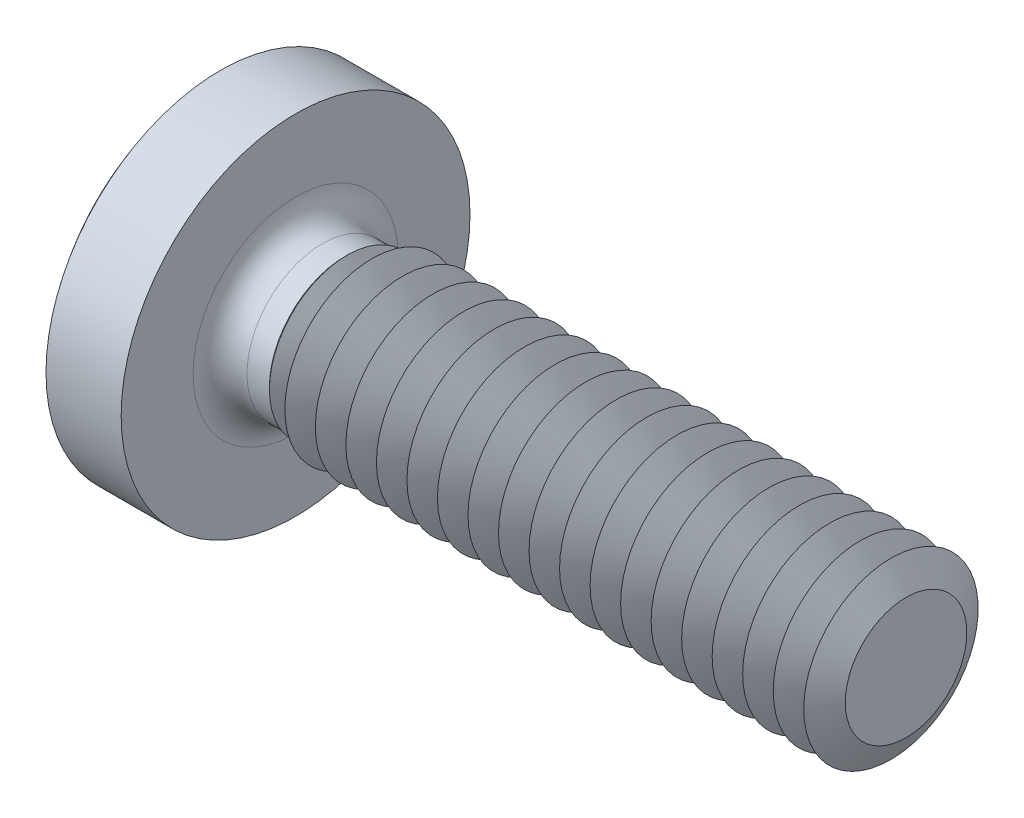
ISO-10303-21;
HEADER;
FILE_DESCRIPTION(('STEP AP214'),'2;1');
FILE_NAME('part.step','',(''),(''),'','','');
FILE_SCHEMA(('AUTOMOTIVE_DESIGN { 1 0 10303 214 1 1 1 1 }'));
ENDSEC;
DATA;
#1=APPLICATION_CONTEXT('core data for automotive mechanical design processes');
#2=APPLICATION_PROTOCOL_DEFINITION('international standard','automotive_design',2000,#1);
#3=PRODUCT_CONTEXT('',#1,'mechanical');
#4=PRODUCT('Part','Part','',(#3));
#5=PRODUCT_RELATED_PRODUCT_CATEGORY('part','',(#4));
#6=PRODUCT_DEFINITION_FORMATION('','',#4);
#7=PRODUCT_DEFINITION_CONTEXT('part definition',#1,'design');
#8=PRODUCT_DEFINITION('design','',#6,#7);
#9=PRODUCT_DEFINITION_SHAPE('','',#8);
#10=(LENGTH_UNIT() NAMED_UNIT(*) SI_UNIT(.MILLI.,.METRE.));
#11=(NAMED_UNIT(*) PLANE_ANGLE_UNIT() SI_UNIT($,.RADIAN.));
#12=(NAMED_UNIT(*) SI_UNIT($,.STERADIAN.) SOLID_ANGLE_UNIT());
#13=UNCERTAINTY_MEASURE_WITH_UNIT(LENGTH_MEASURE(1.E-05),#10,'distance_accuracy_value','');
#14=(GEOMETRIC_REPRESENTATION_CONTEXT(3) GLOBAL_UNCERTAINTY_ASSIGNED_CONTEXT((#13)) GLOBAL_UNIT_ASSIGNED_CONTEXT((#10,
#11,#12)) REPRESENTATION_CONTEXT('',''));
#15=CARTESIAN_POINT('',(0.,0.,0.));
#16=DIRECTION('',(0.,0.,1.));
#17=DIRECTION('',(1.,0.,0.));
#18=AXIS2_PLACEMENT_3D('',#15,#16,#17);
#19=CARTESIAN_POINT('',(2.4,0.,0.));
#20=DIRECTION('',(0.144306893071729,0.,-0.989532981063282));
#21=DIRECTION('',(-0.989532981063282,0.,-0.144306893071729));
#22=AXIS2_PLACEMENT_3D('',#19,#20,#21);
#23=PLANE('',#22);
#24=DIRECTION('',(-0.732931208059297,-0.671853607387689,-0.106885801175314));
#25=VECTOR('',#24,1.);
#26=CARTESIAN_POINT('',(2.4,0.,0.));
#27=LINE('',#26,#25);
#28=CARTESIAN_POINT('',(2.4,0.,0.));
#29=VERTEX_POINT('',#28);
#30=CARTESIAN_POINT('',(0.299339193338267,-1.92560573943992,-0.30634636763817));
#31=VERTEX_POINT('',#30);
#32=EDGE_CURVE('E156',#29,#31,#27,.T.);
#33=ORIENTED_EDGE('',*,*,#32,.F.);
#34=DIRECTION('',(-0.979387903800927,-0.142827402637635,-0.142827402637635));
#35=VECTOR('',#34,1.);
#36=CARTESIAN_POINT('',(2.4,0.,0.));
#37=LINE('',#36,#35);
#38=CARTESIAN_POINT('',(0.0185820115886168,-0.347290123309992,-0.347290123309993));
#39=VERTEX_POINT('',#38);
#40=EDGE_CURVE('E117',#29,#39,#37,.T.);
#41=ORIENTED_EDGE('',*,*,#40,.T.);
#42=CARTESIAN_POINT('',(6.41461963450914,0.,0.585465363365916));
#43=DIRECTION('',(0.144306893071729,0.,-0.989532981063282));
#44=DIRECTION('',(-0.989532981063282,0.,-0.144306893071729));
#45=AXIS2_PLACEMENT_3D('',#42,#43,#44);
#46=CIRCLE('',#45,6.47301633718682);
#47=EDGE_CURVE('E130',#31,#39,#46,.T.);
#48=ORIENTED_EDGE('',*,*,#47,.F.);
#49=EDGE_LOOP('',(#33,#41,#48));
#50=FACE_BOUND('',#49,.T.);
#51=ADVANCED_FACE('F37',(#50),#23,.F.);
#52=CARTESIAN_POINT('',(2.4,0.,0.));
#53=DIRECTION('',(0.144306893071729,0.,0.989532981063282));
#54=DIRECTION('',(0.989532981063282,0.,-0.144306893071729));
#55=AXIS2_PLACEMENT_3D('',#52,#53,#54);
#56=PLANE('',#55);
#57=CARTESIAN_POINT('',(6.41461963450914,0.,-0.585465363365916));
#58=DIRECTION('',(0.144306893071729,0.,0.989532981063282));
#59=DIRECTION('',(0.989532981063282,0.,-0.144306893071729));
#60=AXIS2_PLACEMENT_3D('',#57,#58,#59);
#61=CIRCLE('',#60,6.47301633718682);
#62=CARTESIAN_POINT('',(0.0185820115886177,-0.347290123309995,0.347290123309993));
#63=VERTEX_POINT('',#62);
#64=CARTESIAN_POINT('',(0.299339193338266,-1.92560573943992,0.30634636763817));
#65=VERTEX_POINT('',#64);
#66=EDGE_CURVE('E60',#63,#65,#61,.T.);
#67=ORIENTED_EDGE('',*,*,#66,.F.);
#68=DIRECTION('',(0.979387903800927,0.142827402637636,-0.142827402637635));
#69=VECTOR('',#68,1.);
#70=CARTESIAN_POINT('',(2.4,0.,0.));
#71=LINE('',#70,#69);
#72=EDGE_CURVE('E11',#63,#29,#71,.T.);
#73=ORIENTED_EDGE('',*,*,#72,.T.);
#74=DIRECTION('',(-0.732931208059297,-0.671853607387689,0.106885801175314));
#75=VECTOR('',#74,1.);
#76=CARTESIAN_POINT('',(2.4,0.,0.));
#77=LINE('',#76,#75);
#78=EDGE_CURVE('E157',#29,#65,#77,.T.);
#79=ORIENTED_EDGE('',*,*,#78,.T.);
#80=EDGE_LOOP('',(#67,#73,#79));
#81=FACE_BOUND('',#80,.T.);
#82=ADVANCED_FACE('F172',(#81),#56,.F.);
#83=CARTESIAN_POINT('',(14.653791204021,0.,0.));
#84=DIRECTION('',(-1.,0.,0.));
#85=DIRECTION('',(0.,0.,1.));
#86=AXIS2_PLACEMENT_3D('',#83,#84,#85);
#87=CONICAL_SURFACE('',#86,2.,1.05188801855299);
#88=CARTESIAN_POINT('',(15.,0.,0.));
#89=DIRECTION('',(-1.,0.,0.));
#90=DIRECTION('',(0.,0.,1.));
#91=AXIS2_PLACEMENT_3D('',#88,#89,#90);
#92=CIRCLE('',#91,1.3938);
#93=CARTESIAN_POINT('',(15.,0.,1.3938));
#94=VERTEX_POINT('',#93);
#95=EDGE_CURVE('E278',#94,#94,#92,.T.);
#96=ORIENTED_EDGE('',*,*,#95,.T.);
#97=EDGE_LOOP('',(#96));
#98=FACE_BOUND('',#97,.T.);
#99=CARTESIAN_POINT('',(14.653791204021,0.,0.));
#100=DIRECTION('',(-1.,0.,0.));
#101=DIRECTION('',(0.,0.,1.));
#102=AXIS2_PLACEMENT_3D('',#99,#100,#101);
#103=CIRCLE('',#102,2.);
#104=CARTESIAN_POINT('',(14.653791204021,0.,2.));
#105=VERTEX_POINT('',#104);
#106=EDGE_CURVE('E275',#105,#105,#103,.T.);
#107=ORIENTED_EDGE('',*,*,#106,.F.);
#108=EDGE_LOOP('',(#107));
#109=FACE_BOUND('',#108,.T.);
#110=ADVANCED_FACE('F361',(#98,#109),#87,.T.);
#111=CARTESIAN_POINT('',(15.,0.,0.));
#112=DIRECTION('',(1.,0.,0.));
#113=DIRECTION('',(0.,0.,-1.));
#114=AXIS2_PLACEMENT_3D('',#111,#112,#113);
#115=CONICAL_SURFACE('',#114,1.3938,1.04250708384022);
#116=CARTESIAN_POINT('',(15.353791204021,0.,0.));
#117=DIRECTION('',(-1.,0.,0.));
#118=DIRECTION('',(0.,0.,1.));
#119=AXIS2_PLACEMENT_3D('',#116,#117,#118);
#120=CIRCLE('',#119,2.);
#121=CARTESIAN_POINT('',(15.353791204021,0.,2.));
#122=VERTEX_POINT('',#121);
#123=EDGE_CURVE('E281',#122,#122,#120,.T.);
#124=ORIENTED_EDGE('',*,*,#123,.T.);
#125=EDGE_LOOP('',(#124));
#126=FACE_BOUND('',#125,.T.);
#127=ORIENTED_EDGE('',*,*,#95,.F.);
#128=EDGE_LOOP('',(#127));
#129=FACE_BOUND('',#128,.T.);
#130=ADVANCED_FACE('F777',(#126,#129),#115,.T.);
#131=CARTESIAN_POINT('',(17.1,0.,0.));
#132=DIRECTION('',(-1.,0.,0.));
#133=DIRECTION('',(0.,0.,1.));
#134=AXIS2_PLACEMENT_3D('',#131,#132,#133);
#135=PLANE('',#134);
#136=CARTESIAN_POINT('',(17.1,0.,0.));
#137=DIRECTION('',(-1.,0.,0.));
#138=DIRECTION('',(0.,0.,1.));
#139=AXIS2_PLACEMENT_3D('',#136,#137,#138);
#140=CIRCLE('',#139,1.3938);
#141=CARTESIAN_POINT('',(17.1,0.,1.3938));
#142=VERTEX_POINT('',#141);
#143=EDGE_CURVE('E296',#142,#142,#140,.T.);
#144=ORIENTED_EDGE('',*,*,#143,.F.);
#145=EDGE_LOOP('',(#144));
#146=FACE_BOUND('',#145,.T.);
#147=ADVANCED_FACE('F781',(#146),#135,.F.);
#148=CARTESIAN_POINT('',(16.753791204021,0.,0.));
#149=DIRECTION('',(-1.,0.,0.));
#150=DIRECTION('',(0.,0.,1.));
#151=AXIS2_PLACEMENT_3D('',#148,#149,#150);
#152=CONICAL_SURFACE('',#151,2.,1.05188801855299);
#153=ORIENTED_EDGE('',*,*,#143,.T.);
#154=EDGE_LOOP('',(#153));
#155=FACE_BOUND('',#154,.T.);
#156=CARTESIAN_POINT('',(16.753791204021,0.,0.));
#157=DIRECTION('',(-1.,0.,0.));
#158=DIRECTION('',(0.,0.,1.));
#159=AXIS2_PLACEMENT_3D('',#156,#157,#158);
#160=CIRCLE('',#159,2.);
#161=CARTESIAN_POINT('',(16.753791204021,0.,2.));
#162=VERTEX_POINT('',#161);
#163=EDGE_CURVE('E293',#162,#162,#160,.T.);
#164=ORIENTED_EDGE('',*,*,#163,.F.);
#165=EDGE_LOOP('',(#164));
#166=FACE_BOUND('',#165,.T.);
#167=ADVANCED_FACE('F769',(#155,#166),#152,.T.);
#168=CARTESIAN_POINT('',(16.4,0.,0.));
#169=DIRECTION('',(1.,0.,0.));
#170=DIRECTION('',(0.,0.,-1.));
#171=AXIS2_PLACEMENT_3D('',#168,#169,#170);
#172=CONICAL_SURFACE('',#171,1.3938,1.04250708384022);
#173=ORIENTED_EDGE('',*,*,#163,.T.);
#174=EDGE_LOOP('',(#173));
#175=FACE_BOUND('',#174,.T.);
#176=CARTESIAN_POINT('',(16.4,0.,0.));
#177=DIRECTION('',(-1.,0.,0.));
#178=DIRECTION('',(0.,0.,1.));
#179=AXIS2_PLACEMENT_3D('',#176,#177,#178);
#180=CIRCLE('',#179,1.3938);
#181=CARTESIAN_POINT('',(16.4,0.,1.3938));
#182=VERTEX_POINT('',#181);
#183=EDGE_CURVE('E290',#182,#182,#180,.T.);
#184=ORIENTED_EDGE('',*,*,#183,.F.);
#185=EDGE_LOOP('',(#184));
#186=FACE_BOUND('',#185,.T.);
#187=ADVANCED_FACE('F759',(#175,#186),#172,.T.);
#188=CARTESIAN_POINT('',(16.053791204021,0.,0.));
#189=DIRECTION('',(-1.,0.,0.));
#190=DIRECTION('',(0.,0.,1.));
#191=AXIS2_PLACEMENT_3D('',#188,#189,#190);
#192=CONICAL_SURFACE('',#191,2.,1.05188801855299);
#193=ORIENTED_EDGE('',*,*,#183,.T.);
#194=EDGE_LOOP('',(#193));
#195=FACE_BOUND('',#194,.T.);
#196=CARTESIAN_POINT('',(16.053791204021,0.,0.));
#197=DIRECTION('',(-1.,0.,0.));
#198=DIRECTION('',(0.,0.,1.));
#199=AXIS2_PLACEMENT_3D('',#196,#197,#198);
#200=CIRCLE('',#199,2.);
#201=CARTESIAN_POINT('',(16.053791204021,0.,2.));
#202=VERTEX_POINT('',#201);
#203=EDGE_CURVE('E287',#202,#202,#200,.T.);
#204=ORIENTED_EDGE('',*,*,#203,.F.);
#205=EDGE_LOOP('',(#204));
#206=FACE_BOUND('',#205,.T.);
#207=ADVANCED_FACE('F749',(#195,#206),#192,.T.);
#208=CARTESIAN_POINT('',(15.7,0.,0.));
#209=DIRECTION('',(1.,0.,0.));
#210=DIRECTION('',(0.,0.,-1.));
#211=AXIS2_PLACEMENT_3D('',#208,#209,#210);
#212=CONICAL_SURFACE('',#211,1.3938,1.04250708384022);
#213=ORIENTED_EDGE('',*,*,#203,.T.);
#214=EDGE_LOOP('',(#213));
#215=FACE_BOUND('',#214,.T.);
#216=CARTESIAN_POINT('',(15.7,0.,0.));
#217=DIRECTION('',(-1.,0.,0.));
#218=DIRECTION('',(0.,0.,1.));
#219=AXIS2_PLACEMENT_3D('',#216,#217,#218);
#220=CIRCLE('',#219,1.3938);
#221=CARTESIAN_POINT('',(15.7,0.,1.3938));
#222=VERTEX_POINT('',#221);
#223=EDGE_CURVE('E284',#222,#222,#220,.T.);
#224=ORIENTED_EDGE('',*,*,#223,.F.);
#225=EDGE_LOOP('',(#224));
#226=FACE_BOUND('',#225,.T.);
#227=ADVANCED_FACE('F739',(#215,#226),#212,.T.);
#228=CARTESIAN_POINT('',(15.353791204021,0.,0.));
#229=DIRECTION('',(-1.,0.,0.));
#230=DIRECTION('',(0.,0.,1.));
#231=AXIS2_PLACEMENT_3D('',#228,#229,#230);
#232=CONICAL_SURFACE('',#231,2.,1.05188801855299);
#233=ORIENTED_EDGE('',*,*,#223,.T.);
#234=EDGE_LOOP('',(#233));
#235=FACE_BOUND('',#234,.T.);
#236=ORIENTED_EDGE('',*,*,#123,.F.);
#237=EDGE_LOOP('',(#236));
#238=FACE_BOUND('',#237,.T.);
#239=ADVANCED_FACE('F729',(#235,#238),#232,.T.);
#240=CARTESIAN_POINT('',(13.953791204021,0.,0.));
#241=DIRECTION('',(-1.,0.,0.));
#242=DIRECTION('',(0.,0.,1.));
#243=AXIS2_PLACEMENT_3D('',#240,#241,#242);
#244=CONICAL_SURFACE('',#243,2.,1.05188801855299);
#245=CARTESIAN_POINT('',(14.3,0.,0.));
#246=DIRECTION('',(-1.,0.,0.));
#247=DIRECTION('',(0.,0.,1.));
#248=AXIS2_PLACEMENT_3D('',#245,#246,#247);
#249=CIRCLE('',#248,1.3938);
#250=CARTESIAN_POINT('',(14.3,0.,1.3938));
#251=VERTEX_POINT('',#250);
#252=EDGE_CURVE('E272',#251,#251,#249,.T.);
#253=ORIENTED_EDGE('',*,*,#252,.T.);
#254=EDGE_LOOP('',(#253));
#255=FACE_BOUND('',#254,.T.);
#256=CARTESIAN_POINT('',(13.953791204021,0.,0.));
#257=DIRECTION('',(-1.,0.,0.));
#258=DIRECTION('',(0.,0.,1.));
#259=AXIS2_PLACEMENT_3D('',#256,#257,#258);
#260=CIRCLE('',#259,2.);
#261=CARTESIAN_POINT('',(13.953791204021,0.,2.));
#262=VERTEX_POINT('',#261);
#263=EDGE_CURVE('E269',#262,#262,#260,.T.);
#264=ORIENTED_EDGE('',*,*,#263,.F.);
#265=EDGE_LOOP('',(#264));
#266=FACE_BOUND('',#265,.T.);
#267=ADVANCED_FACE('F719',(#255,#266),#244,.T.);
#268=CARTESIAN_POINT('',(14.3,0.,0.));
#269=DIRECTION('',(1.,0.,0.));
#270=DIRECTION('',(0.,0.,-1.));
#271=AXIS2_PLACEMENT_3D('',#268,#269,#270);
#272=CONICAL_SURFACE('',#271,1.3938,1.04250708384022);
#273=ORIENTED_EDGE('',*,*,#106,.T.);
#274=EDGE_LOOP('',(#273));
#275=FACE_BOUND('',#274,.T.);
#276=ORIENTED_EDGE('',*,*,#252,.F.);
#277=EDGE_LOOP('',(#276));
#278=FACE_BOUND('',#277,.T.);
#279=ADVANCED_FACE('F709',(#275,#278),#272,.T.);
#280=CARTESIAN_POINT('',(13.253791204021,0.,0.));
#281=DIRECTION('',(-1.,0.,0.));
#282=DIRECTION('',(0.,0.,1.));
#283=AXIS2_PLACEMENT_3D('',#280,#281,#282);
#284=CONICAL_SURFACE('',#283,2.,1.05188801855299);
#285=CARTESIAN_POINT('',(13.6,0.,0.));
#286=DIRECTION('',(-1.,0.,0.));
#287=DIRECTION('',(0.,0.,1.));
#288=AXIS2_PLACEMENT_3D('',#285,#286,#287);
#289=CIRCLE('',#288,1.3938);
#290=CARTESIAN_POINT('',(13.6,0.,1.3938));
#291=VERTEX_POINT('',#290);
#292=EDGE_CURVE('E266',#291,#291,#289,.T.);
#293=ORIENTED_EDGE('',*,*,#292,.T.);
#294=EDGE_LOOP('',(#293));
#295=FACE_BOUND('',#294,.T.);
#296=CARTESIAN_POINT('',(13.253791204021,0.,0.));
#297=DIRECTION('',(-1.,0.,0.));
#298=DIRECTION('',(0.,0.,1.));
#299=AXIS2_PLACEMENT_3D('',#296,#297,#298);
#300=CIRCLE('',#299,2.);
#301=CARTESIAN_POINT('',(13.253791204021,0.,2.));
#302=VERTEX_POINT('',#301);
#303=EDGE_CURVE('E263',#302,#302,#300,.T.);
#304=ORIENTED_EDGE('',*,*,#303,.F.);
#305=EDGE_LOOP('',(#304));
#306=FACE_BOUND('',#305,.T.);
#307=ADVANCED_FACE('F699',(#295,#306),#284,.T.);
#308=CARTESIAN_POINT('',(13.6,0.,0.));
#309=DIRECTION('',(1.,0.,0.));
#310=DIRECTION('',(0.,0.,-1.));
#311=AXIS2_PLACEMENT_3D('',#308,#309,#310);
#312=CONICAL_SURFACE('',#311,1.3938,1.04250708384022);
#313=ORIENTED_EDGE('',*,*,#263,.T.);
#314=EDGE_LOOP('',(#313));
#315=FACE_BOUND('',#314,.T.);
#316=ORIENTED_EDGE('',*,*,#292,.F.);
#317=EDGE_LOOP('',(#316));
#318=FACE_BOUND('',#317,.T.);
#319=ADVANCED_FACE('F689',(#315,#318),#312,.T.);
#320=CARTESIAN_POINT('',(12.553791204021,0.,0.));
#321=DIRECTION('',(-1.,0.,0.));
#322=DIRECTION('',(0.,0.,1.));
#323=AXIS2_PLACEMENT_3D('',#320,#321,#322);
#324=CONICAL_SURFACE('',#323,2.,1.05188801855299);
#325=CARTESIAN_POINT('',(12.9,0.,0.));
#326=DIRECTION('',(-1.,0.,0.));
#327=DIRECTION('',(0.,0.,1.));
#328=AXIS2_PLACEMENT_3D('',#325,#326,#327);
#329=CIRCLE('',#328,1.3938);
#330=CARTESIAN_POINT('',(12.9,0.,1.3938));
#331=VERTEX_POINT('',#330);
#332=EDGE_CURVE('E260',#331,#331,#329,.T.);
#333=ORIENTED_EDGE('',*,*,#332,.T.);
#334=EDGE_LOOP('',(#333));
#335=FACE_BOUND('',#334,.T.);
#336=CARTESIAN_POINT('',(12.553791204021,0.,0.));
#337=DIRECTION('',(-1.,0.,0.));
#338=DIRECTION('',(0.,0.,1.));
#339=AXIS2_PLACEMENT_3D('',#336,#337,#338);
#340=CIRCLE('',#339,2.);
#341=CARTESIAN_POINT('',(12.553791204021,0.,2.));
#342=VERTEX_POINT('',#341);
#343=EDGE_CURVE('E257',#342,#342,#340,.T.);
#344=ORIENTED_EDGE('',*,*,#343,.F.);
#345=EDGE_LOOP('',(#344));
#346=FACE_BOUND('',#345,.T.);
#347=ADVANCED_FACE('F679',(#335,#346),#324,.T.);
#348=CARTESIAN_POINT('',(12.9,0.,0.));
#349=DIRECTION('',(1.,0.,0.));
#350=DIRECTION('',(0.,0.,-1.));
#351=AXIS2_PLACEMENT_3D('',#348,#349,#350);
#352=CONICAL_SURFACE('',#351,1.3938,1.04250708384022);
#353=ORIENTED_EDGE('',*,*,#303,.T.);
#354=EDGE_LOOP('',(#353));
#355=FACE_BOUND('',#354,.T.);
#356=ORIENTED_EDGE('',*,*,#332,.F.);
#357=EDGE_LOOP('',(#356));
#358=FACE_BOUND('',#357,.T.);
#359=ADVANCED_FACE('F669',(#355,#358),#352,.T.);
#360=CARTESIAN_POINT('',(11.853791204021,0.,0.));
#361=DIRECTION('',(-1.,0.,0.));
#362=DIRECTION('',(0.,0.,1.));
#363=AXIS2_PLACEMENT_3D('',#360,#361,#362);
#364=CONICAL_SURFACE('',#363,2.,1.05188801855299);
#365=CARTESIAN_POINT('',(12.2,0.,0.));
#366=DIRECTION('',(-1.,0.,0.));
#367=DIRECTION('',(0.,0.,1.));
#368=AXIS2_PLACEMENT_3D('',#365,#366,#367);
#369=CIRCLE('',#368,1.3938);
#370=CARTESIAN_POINT('',(12.2,0.,1.3938));
#371=VERTEX_POINT('',#370);
#372=EDGE_CURVE('E254',#371,#371,#369,.T.);
#373=ORIENTED_EDGE('',*,*,#372,.T.);
#374=EDGE_LOOP('',(#373));
#375=FACE_BOUND('',#374,.T.);
#376=CARTESIAN_POINT('',(11.853791204021,0.,0.));
#377=DIRECTION('',(-1.,0.,0.));
#378=DIRECTION('',(0.,0.,1.));
#379=AXIS2_PLACEMENT_3D('',#376,#377,#378);
#380=CIRCLE('',#379,2.);
#381=CARTESIAN_POINT('',(11.853791204021,0.,2.));
#382=VERTEX_POINT('',#381);
#383=EDGE_CURVE('E251',#382,#382,#380,.T.);
#384=ORIENTED_EDGE('',*,*,#383,.F.);
#385=EDGE_LOOP('',(#384));
#386=FACE_BOUND('',#385,.T.);
#387=ADVANCED_FACE('F659',(#375,#386),#364,.T.);
#388=CARTESIAN_POINT('',(12.2,0.,0.));
#389=DIRECTION('',(1.,0.,0.));
#390=DIRECTION('',(0.,0.,-1.));
#391=AXIS2_PLACEMENT_3D('',#388,#389,#390);
#392=CONICAL_SURFACE('',#391,1.3938,1.04250708384022);
#393=ORIENTED_EDGE('',*,*,#343,.T.);
#394=EDGE_LOOP('',(#393));
#395=FACE_BOUND('',#394,.T.);
#396=ORIENTED_EDGE('',*,*,#372,.F.);
#397=EDGE_LOOP('',(#396));
#398=FACE_BOUND('',#397,.T.);
#399=ADVANCED_FACE('F649',(#395,#398),#392,.T.);
#400=CARTESIAN_POINT('',(11.153791204021,0.,0.));
#401=DIRECTION('',(-1.,0.,0.));
#402=DIRECTION('',(0.,0.,1.));
#403=AXIS2_PLACEMENT_3D('',#400,#401,#402);
#404=CONICAL_SURFACE('',#403,2.,1.05188801855299);
#405=CARTESIAN_POINT('',(11.5,0.,0.));
#406=DIRECTION('',(-1.,0.,0.));
#407=DIRECTION('',(0.,0.,1.));
#408=AXIS2_PLACEMENT_3D('',#405,#406,#407);
#409=CIRCLE('',#408,1.3938);
#410=CARTESIAN_POINT('',(11.5,0.,1.3938));
#411=VERTEX_POINT('',#410);
#412=EDGE_CURVE('E248',#411,#411,#409,.T.);
#413=ORIENTED_EDGE('',*,*,#412,.T.);
#414=EDGE_LOOP('',(#413));
#415=FACE_BOUND('',#414,.T.);
#416=CARTESIAN_POINT('',(11.153791204021,0.,0.));
#417=DIRECTION('',(-1.,0.,0.));
#418=DIRECTION('',(0.,0.,1.));
#419=AXIS2_PLACEMENT_3D('',#416,#417,#418);
#420=CIRCLE('',#419,2.);
#421=CARTESIAN_POINT('',(11.153791204021,0.,2.));
#422=VERTEX_POINT('',#421);
#423=EDGE_CURVE('E245',#422,#422,#420,.T.);
#424=ORIENTED_EDGE('',*,*,#423,.F.);
#425=EDGE_LOOP('',(#424));
#426=FACE_BOUND('',#425,.T.);
#427=ADVANCED_FACE('F639',(#415,#426),#404,.T.);
#428=CARTESIAN_POINT('',(11.5,0.,0.));
#429=DIRECTION('',(1.,0.,0.));
#430=DIRECTION('',(0.,0.,-1.));
#431=AXIS2_PLACEMENT_3D('',#428,#429,#430);
#432=CONICAL_SURFACE('',#431,1.3938,1.04250708384022);
#433=ORIENTED_EDGE('',*,*,#383,.T.);
#434=EDGE_LOOP('',(#433));
#435=FACE_BOUND('',#434,.T.);
#436=ORIENTED_EDGE('',*,*,#412,.F.);
#437=EDGE_LOOP('',(#436));
#438=FACE_BOUND('',#437,.T.);
#439=ADVANCED_FACE('F629',(#435,#438),#432,.T.);
#440=CARTESIAN_POINT('',(10.453791204021,0.,0.));
#441=DIRECTION('',(-1.,0.,0.));
#442=DIRECTION('',(0.,0.,1.));
#443=AXIS2_PLACEMENT_3D('',#440,#441,#442);
#444=CONICAL_SURFACE('',#443,2.,1.05188801855299);
#445=CARTESIAN_POINT('',(10.8,0.,0.));
#446=DIRECTION('',(-1.,0.,0.));
#447=DIRECTION('',(0.,0.,1.));
#448=AXIS2_PLACEMENT_3D('',#445,#446,#447);
#449=CIRCLE('',#448,1.3938);
#450=CARTESIAN_POINT('',(10.8,0.,1.3938));
#451=VERTEX_POINT('',#450);
#452=EDGE_CURVE('E242',#451,#451,#449,.T.);
#453=ORIENTED_EDGE('',*,*,#452,.T.);
#454=EDGE_LOOP('',(#453));
#455=FACE_BOUND('',#454,.T.);
#456=CARTESIAN_POINT('',(10.453791204021,0.,0.));
#457=DIRECTION('',(-1.,0.,0.));
#458=DIRECTION('',(0.,0.,1.));
#459=AXIS2_PLACEMENT_3D('',#456,#457,#458);
#460=CIRCLE('',#459,2.);
#461=CARTESIAN_POINT('',(10.453791204021,0.,2.));
#462=VERTEX_POINT('',#461);
#463=EDGE_CURVE('E239',#462,#462,#460,.T.);
#464=ORIENTED_EDGE('',*,*,#463,.F.);
#465=EDGE_LOOP('',(#464));
#466=FACE_BOUND('',#465,.T.);
#467=ADVANCED_FACE('F619',(#455,#466),#444,.T.);
#468=CARTESIAN_POINT('',(10.8,0.,0.));
#469=DIRECTION('',(1.,0.,0.));
#470=DIRECTION('',(0.,0.,-1.));
#471=AXIS2_PLACEMENT_3D('',#468,#469,#470);
#472=CONICAL_SURFACE('',#471,1.3938,1.04250708384022);
#473=ORIENTED_EDGE('',*,*,#423,.T.);
#474=EDGE_LOOP('',(#473));
#475=FACE_BOUND('',#474,.T.);
#476=ORIENTED_EDGE('',*,*,#452,.F.);
#477=EDGE_LOOP('',(#476));
#478=FACE_BOUND('',#477,.T.);
#479=ADVANCED_FACE('F609',(#475,#478),#472,.T.);
#480=CARTESIAN_POINT('',(9.75379120402105,0.,0.));
#481=DIRECTION('',(-1.,0.,0.));
#482=DIRECTION('',(0.,0.,1.));
#483=AXIS2_PLACEMENT_3D('',#480,#481,#482);
#484=CONICAL_SURFACE('',#483,2.,1.05188801855299);
#485=CARTESIAN_POINT('',(10.1,0.,0.));
#486=DIRECTION('',(-1.,0.,0.));
#487=DIRECTION('',(0.,0.,1.));
#488=AXIS2_PLACEMENT_3D('',#485,#486,#487);
#489=CIRCLE('',#488,1.3938);
#490=CARTESIAN_POINT('',(10.1,0.,1.3938));
#491=VERTEX_POINT('',#490);
#492=EDGE_CURVE('E236',#491,#491,#489,.T.);
#493=ORIENTED_EDGE('',*,*,#492,.T.);
#494=EDGE_LOOP('',(#493));
#495=FACE_BOUND('',#494,.T.);
#496=CARTESIAN_POINT('',(9.75379120402105,0.,0.));
#497=DIRECTION('',(-1.,0.,0.));
#498=DIRECTION('',(0.,0.,1.));
#499=AXIS2_PLACEMENT_3D('',#496,#497,#498);
#500=CIRCLE('',#499,2.);
#501=CARTESIAN_POINT('',(9.75379120402105,0.,2.));
#502=VERTEX_POINT('',#501);
#503=EDGE_CURVE('E233',#502,#502,#500,.T.);
#504=ORIENTED_EDGE('',*,*,#503,.F.);
#505=EDGE_LOOP('',(#504));
#506=FACE_BOUND('',#505,.T.);
#507=ADVANCED_FACE('F599',(#495,#506),#484,.T.);
#508=CARTESIAN_POINT('',(10.1,0.,0.));
#509=DIRECTION('',(1.,0.,0.));
#510=DIRECTION('',(0.,0.,-1.));
#511=AXIS2_PLACEMENT_3D('',#508,#509,#510);
#512=CONICAL_SURFACE('',#511,1.3938,1.04250708384022);
#513=ORIENTED_EDGE('',*,*,#463,.T.);
#514=EDGE_LOOP('',(#513));
#515=FACE_BOUND('',#514,.T.);
#516=ORIENTED_EDGE('',*,*,#492,.F.);
#517=EDGE_LOOP('',(#516));
#518=FACE_BOUND('',#517,.T.);
#519=ADVANCED_FACE('F589',(#515,#518),#512,.T.);
#520=CARTESIAN_POINT('',(9.05379120402105,0.,0.));
#521=DIRECTION('',(-1.,0.,0.));
#522=DIRECTION('',(0.,0.,1.));
#523=AXIS2_PLACEMENT_3D('',#520,#521,#522);
#524=CONICAL_SURFACE('',#523,2.,1.05188801855299);
#525=CARTESIAN_POINT('',(9.4,0.,0.));
#526=DIRECTION('',(-1.,0.,0.));
#527=DIRECTION('',(0.,0.,1.));
#528=AXIS2_PLACEMENT_3D('',#525,#526,#527);
#529=CIRCLE('',#528,1.3938);
#530=CARTESIAN_POINT('',(9.4,0.,1.3938));
#531=VERTEX_POINT('',#530);
#532=EDGE_CURVE('E230',#531,#531,#529,.T.);
#533=ORIENTED_EDGE('',*,*,#532,.T.);
#534=EDGE_LOOP('',(#533));
#535=FACE_BOUND('',#534,.T.);
#536=CARTESIAN_POINT('',(9.05379120402105,0.,0.));
#537=DIRECTION('',(-1.,0.,0.));
#538=DIRECTION('',(0.,0.,1.));
#539=AXIS2_PLACEMENT_3D('',#536,#537,#538);
#540=CIRCLE('',#539,2.);
#541=CARTESIAN_POINT('',(9.05379120402105,0.,2.));
#542=VERTEX_POINT('',#541);
#543=EDGE_CURVE('E227',#542,#542,#540,.T.);
#544=ORIENTED_EDGE('',*,*,#543,.F.);
#545=EDGE_LOOP('',(#544));
#546=FACE_BOUND('',#545,.T.);
#547=ADVANCED_FACE('F579',(#535,#546),#524,.T.);
#548=CARTESIAN_POINT('',(9.4,0.,0.));
#549=DIRECTION('',(1.,0.,0.));
#550=DIRECTION('',(0.,0.,-1.));
#551=AXIS2_PLACEMENT_3D('',#548,#549,#550);
#552=CONICAL_SURFACE('',#551,1.3938,1.04250708384022);
#553=ORIENTED_EDGE('',*,*,#503,.T.);
#554=EDGE_LOOP('',(#553));
#555=FACE_BOUND('',#554,.T.);
#556=ORIENTED_EDGE('',*,*,#532,.F.);
#557=EDGE_LOOP('',(#556));
#558=FACE_BOUND('',#557,.T.);
#559=ADVANCED_FACE('F569',(#555,#558),#552,.T.);
#560=CARTESIAN_POINT('',(8.35379120402105,0.,0.));
#561=DIRECTION('',(-1.,0.,0.));
#562=DIRECTION('',(0.,0.,1.));
#563=AXIS2_PLACEMENT_3D('',#560,#561,#562);
#564=CONICAL_SURFACE('',#563,2.,1.05188801855299);
#565=CARTESIAN_POINT('',(8.7,0.,0.));
#566=DIRECTION('',(-1.,0.,0.));
#567=DIRECTION('',(0.,0.,1.));
#568=AXIS2_PLACEMENT_3D('',#565,#566,#567);
#569=CIRCLE('',#568,1.3938);
#570=CARTESIAN_POINT('',(8.7,0.,1.3938));
#571=VERTEX_POINT('',#570);
#572=EDGE_CURVE('E224',#571,#571,#569,.T.);
#573=ORIENTED_EDGE('',*,*,#572,.T.);
#574=EDGE_LOOP('',(#573));
#575=FACE_BOUND('',#574,.T.);
#576=CARTESIAN_POINT('',(8.35379120402105,0.,0.));
#577=DIRECTION('',(-1.,0.,0.));
#578=DIRECTION('',(0.,0.,1.));
#579=AXIS2_PLACEMENT_3D('',#576,#577,#578);
#580=CIRCLE('',#579,2.);
#581=CARTESIAN_POINT('',(8.35379120402105,0.,2.));
#582=VERTEX_POINT('',#581);
#583=EDGE_CURVE('E221',#582,#582,#580,.T.);
#584=ORIENTED_EDGE('',*,*,#583,.F.);
#585=EDGE_LOOP('',(#584));
#586=FACE_BOUND('',#585,.T.);
#587=ADVANCED_FACE('F559',(#575,#586),#564,.T.);
#588=CARTESIAN_POINT('',(8.7,0.,0.));
#589=DIRECTION('',(1.,0.,0.));
#590=DIRECTION('',(0.,0.,-1.));
#591=AXIS2_PLACEMENT_3D('',#588,#589,#590);
#592=CONICAL_SURFACE('',#591,1.3938,1.04250708384022);
#593=ORIENTED_EDGE('',*,*,#543,.T.);
#594=EDGE_LOOP('',(#593));
#595=FACE_BOUND('',#594,.T.);
#596=ORIENTED_EDGE('',*,*,#572,.F.);
#597=EDGE_LOOP('',(#596));
#598=FACE_BOUND('',#597,.T.);
#599=ADVANCED_FACE('F549',(#595,#598),#592,.T.);
#600=CARTESIAN_POINT('',(7.65379120402105,0.,0.));
#601=DIRECTION('',(-1.,0.,0.));
#602=DIRECTION('',(0.,0.,1.));
#603=AXIS2_PLACEMENT_3D('',#600,#601,#602);
#604=CONICAL_SURFACE('',#603,2.,1.05188801855299);
#605=CARTESIAN_POINT('',(8.,0.,0.));
#606=DIRECTION('',(-1.,0.,0.));
#607=DIRECTION('',(0.,0.,1.));
#608=AXIS2_PLACEMENT_3D('',#605,#606,#607);
#609=CIRCLE('',#608,1.3938);
#610=CARTESIAN_POINT('',(8.,0.,1.3938));
#611=VERTEX_POINT('',#610);
#612=EDGE_CURVE('E218',#611,#611,#609,.T.);
#613=ORIENTED_EDGE('',*,*,#612,.T.);
#614=EDGE_LOOP('',(#613));
#615=FACE_BOUND('',#614,.T.);
#616=CARTESIAN_POINT('',(7.65379120402105,0.,0.));
#617=DIRECTION('',(-1.,0.,0.));
#618=DIRECTION('',(0.,0.,1.));
#619=AXIS2_PLACEMENT_3D('',#616,#617,#618);
#620=CIRCLE('',#619,2.);
#621=CARTESIAN_POINT('',(7.65379120402105,0.,2.));
#622=VERTEX_POINT('',#621);
#623=EDGE_CURVE('E215',#622,#622,#620,.T.);
#624=ORIENTED_EDGE('',*,*,#623,.F.);
#625=EDGE_LOOP('',(#624));
#626=FACE_BOUND('',#625,.T.);
#627=ADVANCED_FACE('F539',(#615,#626),#604,.T.);
#628=CARTESIAN_POINT('',(8.,0.,0.));
#629=DIRECTION('',(1.,0.,0.));
#630=DIRECTION('',(0.,0.,-1.));
#631=AXIS2_PLACEMENT_3D('',#628,#629,#630);
#632=CONICAL_SURFACE('',#631,1.3938,1.04250708384022);
#633=ORIENTED_EDGE('',*,*,#583,.T.);
#634=EDGE_LOOP('',(#633));
#635=FACE_BOUND('',#634,.T.);
#636=ORIENTED_EDGE('',*,*,#612,.F.);
#637=EDGE_LOOP('',(#636));
#638=FACE_BOUND('',#637,.T.);
#639=ADVANCED_FACE('F529',(#635,#638),#632,.T.);
#640=CARTESIAN_POINT('',(6.95379120402105,0.,0.));
#641=DIRECTION('',(-1.,0.,0.));
#642=DIRECTION('',(0.,0.,1.));
#643=AXIS2_PLACEMENT_3D('',#640,#641,#642);
#644=CONICAL_SURFACE('',#643,2.,1.05188801855299);
#645=CARTESIAN_POINT('',(7.3,0.,0.));
#646=DIRECTION('',(-1.,0.,0.));
#647=DIRECTION('',(0.,0.,1.));
#648=AXIS2_PLACEMENT_3D('',#645,#646,#647);
#649=CIRCLE('',#648,1.3938);
#650=CARTESIAN_POINT('',(7.3,0.,1.3938));
#651=VERTEX_POINT('',#650);
#652=EDGE_CURVE('E212',#651,#651,#649,.T.);
#653=ORIENTED_EDGE('',*,*,#652,.T.);
#654=EDGE_LOOP('',(#653));
#655=FACE_BOUND('',#654,.T.);
#656=CARTESIAN_POINT('',(6.95379120402105,0.,0.));
#657=DIRECTION('',(-1.,0.,0.));
#658=DIRECTION('',(0.,0.,1.));
#659=AXIS2_PLACEMENT_3D('',#656,#657,#658);
#660=CIRCLE('',#659,2.);
#661=CARTESIAN_POINT('',(6.95379120402105,0.,2.));
#662=VERTEX_POINT('',#661);
#663=EDGE_CURVE('E209',#662,#662,#660,.T.);
#664=ORIENTED_EDGE('',*,*,#663,.F.);
#665=EDGE_LOOP('',(#664));
#666=FACE_BOUND('',#665,.T.);
#667=ADVANCED_FACE('F519',(#655,#666),#644,.T.);
#668=CARTESIAN_POINT('',(7.3,0.,0.));
#669=DIRECTION('',(1.,0.,0.));
#670=DIRECTION('',(0.,0.,-1.));
#671=AXIS2_PLACEMENT_3D('',#668,#669,#670);
#672=CONICAL_SURFACE('',#671,1.3938,1.04250708384022);
#673=ORIENTED_EDGE('',*,*,#623,.T.);
#674=EDGE_LOOP('',(#673));
#675=FACE_BOUND('',#674,.T.);
#676=ORIENTED_EDGE('',*,*,#652,.F.);
#677=EDGE_LOOP('',(#676));
#678=FACE_BOUND('',#677,.T.);
#679=ADVANCED_FACE('F509',(#675,#678),#672,.T.);
#680=CARTESIAN_POINT('',(6.25379120402105,0.,0.));
#681=DIRECTION('',(-1.,0.,0.));
#682=DIRECTION('',(0.,0.,1.));
#683=AXIS2_PLACEMENT_3D('',#680,#681,#682);
#684=CONICAL_SURFACE('',#683,2.,1.05188801855299);
#685=CARTESIAN_POINT('',(6.6,0.,0.));
#686=DIRECTION('',(-1.,0.,0.));
#687=DIRECTION('',(0.,0.,1.));
#688=AXIS2_PLACEMENT_3D('',#685,#686,#687);
#689=CIRCLE('',#688,1.3938);
#690=CARTESIAN_POINT('',(6.6,0.,1.3938));
#691=VERTEX_POINT('',#690);
#692=EDGE_CURVE('E206',#691,#691,#689,.T.);
#693=ORIENTED_EDGE('',*,*,#692,.T.);
#694=EDGE_LOOP('',(#693));
#695=FACE_BOUND('',#694,.T.);
#696=CARTESIAN_POINT('',(6.25379120402105,0.,0.));
#697=DIRECTION('',(-1.,0.,0.));
#698=DIRECTION('',(0.,0.,1.));
#699=AXIS2_PLACEMENT_3D('',#696,#697,#698);
#700=CIRCLE('',#699,2.);
#701=CARTESIAN_POINT('',(6.25379120402105,0.,2.));
#702=VERTEX_POINT('',#701);
#703=EDGE_CURVE('E203',#702,#702,#700,.T.);
#704=ORIENTED_EDGE('',*,*,#703,.F.);
#705=EDGE_LOOP('',(#704));
#706=FACE_BOUND('',#705,.T.);
#707=ADVANCED_FACE('F499',(#695,#706),#684,.T.);
#708=CARTESIAN_POINT('',(6.6,0.,0.));
#709=DIRECTION('',(1.,0.,0.));
#710=DIRECTION('',(0.,0.,-1.));
#711=AXIS2_PLACEMENT_3D('',#708,#709,#710);
#712=CONICAL_SURFACE('',#711,1.3938,1.04250708384022);
#713=ORIENTED_EDGE('',*,*,#663,.T.);
#714=EDGE_LOOP('',(#713));
#715=FACE_BOUND('',#714,.T.);
#716=ORIENTED_EDGE('',*,*,#692,.F.);
#717=EDGE_LOOP('',(#716));
#718=FACE_BOUND('',#717,.T.);
#719=ADVANCED_FACE('F489',(#715,#718),#712,.T.);
#720=CARTESIAN_POINT('',(5.55379120402105,0.,0.));
#721=DIRECTION('',(-1.,0.,0.));
#722=DIRECTION('',(0.,0.,1.));
#723=AXIS2_PLACEMENT_3D('',#720,#721,#722);
#724=CONICAL_SURFACE('',#723,2.,1.05188801855299);
#725=CARTESIAN_POINT('',(5.9,0.,0.));
#726=DIRECTION('',(-1.,0.,0.));
#727=DIRECTION('',(0.,0.,1.));
#728=AXIS2_PLACEMENT_3D('',#725,#726,#727);
#729=CIRCLE('',#728,1.3938);
#730=CARTESIAN_POINT('',(5.9,0.,1.3938));
#731=VERTEX_POINT('',#730);
#732=EDGE_CURVE('E200',#731,#731,#729,.T.);
#733=ORIENTED_EDGE('',*,*,#732,.T.);
#734=EDGE_LOOP('',(#733));
#735=FACE_BOUND('',#734,.T.);
#736=CARTESIAN_POINT('',(5.55379120402105,0.,0.));
#737=DIRECTION('',(-1.,0.,0.));
#738=DIRECTION('',(0.,0.,1.));
#739=AXIS2_PLACEMENT_3D('',#736,#737,#738);
#740=CIRCLE('',#739,2.);
#741=CARTESIAN_POINT('',(5.55379120402105,0.,2.));
#742=VERTEX_POINT('',#741);
#743=EDGE_CURVE('E197',#742,#742,#740,.T.);
#744=ORIENTED_EDGE('',*,*,#743,.F.);
#745=EDGE_LOOP('',(#744));
#746=FACE_BOUND('',#745,.T.);
#747=ADVANCED_FACE('F479',(#735,#746),#724,.T.);
#748=CARTESIAN_POINT('',(5.9,0.,0.));
#749=DIRECTION('',(1.,0.,0.));
#750=DIRECTION('',(0.,0.,-1.));
#751=AXIS2_PLACEMENT_3D('',#748,#749,#750);
#752=CONICAL_SURFACE('',#751,1.3938,1.04250708384022);
#753=ORIENTED_EDGE('',*,*,#703,.T.);
#754=EDGE_LOOP('',(#753));
#755=FACE_BOUND('',#754,.T.);
#756=ORIENTED_EDGE('',*,*,#732,.F.);
#757=EDGE_LOOP('',(#756));
#758=FACE_BOUND('',#757,.T.);
#759=ADVANCED_FACE('F469',(#755,#758),#752,.T.);
#760=CARTESIAN_POINT('',(4.85379120402105,0.,0.));
#761=DIRECTION('',(-1.,0.,0.));
#762=DIRECTION('',(0.,0.,1.));
#763=AXIS2_PLACEMENT_3D('',#760,#761,#762);
#764=CONICAL_SURFACE('',#763,2.,1.05188801855299);
#765=CARTESIAN_POINT('',(5.2,0.,0.));
#766=DIRECTION('',(-1.,0.,0.));
#767=DIRECTION('',(0.,0.,1.));
#768=AXIS2_PLACEMENT_3D('',#765,#766,#767);
#769=CIRCLE('',#768,1.3938);
#770=CARTESIAN_POINT('',(5.2,0.,1.3938));
#771=VERTEX_POINT('',#770);
#772=EDGE_CURVE('E194',#771,#771,#769,.T.);
#773=ORIENTED_EDGE('',*,*,#772,.T.);
#774=EDGE_LOOP('',(#773));
#775=FACE_BOUND('',#774,.T.);
#776=CARTESIAN_POINT('',(4.85379120402105,0.,0.));
#777=DIRECTION('',(-1.,0.,0.));
#778=DIRECTION('',(0.,0.,1.));
#779=AXIS2_PLACEMENT_3D('',#776,#777,#778);
#780=CIRCLE('',#779,2.);
#781=CARTESIAN_POINT('',(4.85379120402105,0.,2.));
#782=VERTEX_POINT('',#781);
#783=EDGE_CURVE('E191',#782,#782,#780,.T.);
#784=ORIENTED_EDGE('',*,*,#783,.F.);
#785=EDGE_LOOP('',(#784));
#786=FACE_BOUND('',#785,.T.);
#787=ADVANCED_FACE('F353',(#775,#786),#764,.T.);
#788=CARTESIAN_POINT('',(5.2,0.,0.));
#789=DIRECTION('',(1.,0.,0.));
#790=DIRECTION('',(0.,0.,-1.));
#791=AXIS2_PLACEMENT_3D('',#788,#789,#790);
#792=CONICAL_SURFACE('',#791,1.3938,1.04250708384022);
#793=ORIENTED_EDGE('',*,*,#743,.T.);
#794=EDGE_LOOP('',(#793));
#795=FACE_BOUND('',#794,.T.);
#796=ORIENTED_EDGE('',*,*,#772,.F.);
#797=EDGE_LOOP('',(#796));
#798=FACE_BOUND('',#797,.T.);
#799=ADVANCED_FACE('F344',(#795,#798),#792,.T.);
#800=CARTESIAN_POINT('',(4.15379120402105,0.,0.));
#801=DIRECTION('',(-1.,0.,0.));
#802=DIRECTION('',(0.,0.,1.));
#803=AXIS2_PLACEMENT_3D('',#800,#801,#802);
#804=CONICAL_SURFACE('',#803,2.,1.05188801855299);
#805=CARTESIAN_POINT('',(4.5,0.,0.));
#806=DIRECTION('',(-1.,0.,0.));
#807=DIRECTION('',(0.,0.,1.));
#808=AXIS2_PLACEMENT_3D('',#805,#806,#807);
#809=CIRCLE('',#808,1.3938);
#810=CARTESIAN_POINT('',(4.5,0.,1.3938));
#811=VERTEX_POINT('',#810);
#812=EDGE_CURVE('E161',#811,#811,#809,.T.);
#813=ORIENTED_EDGE('',*,*,#812,.T.);
#814=EDGE_LOOP('',(#813));
#815=FACE_BOUND('',#814,.T.);
#816=CARTESIAN_POINT('',(4.27964108163583,0.,0.));
#817=DIRECTION('',(-1.,0.,0.));
#818=DIRECTION('',(0.,0.,1.));
#819=AXIS2_PLACEMENT_3D('',#816,#817,#818);
#820=CIRCLE('',#819,1.77964108163583);
#821=CARTESIAN_POINT('',(4.27964108163583,0.,1.77964108163583));
#822=VERTEX_POINT('',#821);
#823=EDGE_CURVE('E180',#822,#822,#820,.F.);
#824=ORIENTED_EDGE('',*,*,#823,.T.);
#825=EDGE_LOOP('',(#824));
#826=FACE_BOUND('',#825,.T.);
#827=ADVANCED_FACE('F341',(#815,#826),#804,.T.);
#828=CARTESIAN_POINT('',(4.5,0.,0.));
#829=DIRECTION('',(1.,0.,0.));
#830=DIRECTION('',(0.,0.,-1.));
#831=AXIS2_PLACEMENT_3D('',#828,#829,#830);
#832=CONICAL_SURFACE('',#831,1.3938,1.04250708384022);
#833=ORIENTED_EDGE('',*,*,#783,.T.);
#834=EDGE_LOOP('',(#833));
#835=FACE_BOUND('',#834,.T.);
#836=ORIENTED_EDGE('',*,*,#812,.F.);
#837=EDGE_LOOP('',(#836));
#838=FACE_BOUND('',#837,.T.);
#839=ADVANCED_FACE('F343',(#835,#838),#832,.T.);
#840=CARTESIAN_POINT('',(6.5,0.,0.));
#841=DIRECTION('',(-1.,0.,0.));
#842=DIRECTION('',(0.,1.,0.));
#843=AXIS2_PLACEMENT_3D('',#840,#841,#842);
#844=SPHERICAL_SURFACE('',#843,6.5);
#845=CARTESIAN_POINT('',(4.62792452830189,0.,-2.0422641509434));
#846=DIRECTION('',(0.675724628517346,0.,0.737154140200741));
#847=DIRECTION('',(0.737154140200741,0.,-0.675724628517346));
#848=AXIS2_PLACEMENT_3D('',#845,#846,#847);
#849=CIRCLE('',#848,5.88000770118864);
#850=CARTESIAN_POINT('',(0.299339193338266,0.306346367638162,1.92560573943992));
#851=VERTEX_POINT('',#850);
#852=CARTESIAN_POINT('',(0.299339193338267,-0.306346367638176,1.92560573943992));
#853=VERTEX_POINT('',#852);
#854=EDGE_CURVE('E123',#851,#853,#849,.T.);
#855=ORIENTED_EDGE('',*,*,#854,.T.);
#856=CARTESIAN_POINT('',(6.41461963450914,0.585465363365916,0.));
#857=DIRECTION('',(0.144306893071729,-0.989532981063282,0.));
#858=DIRECTION('',(0.989532981063282,0.144306893071729,0.));
#859=AXIS2_PLACEMENT_3D('',#856,#857,#858);
#860=CIRCLE('',#859,6.47301633718682);
#861=EDGE_CURVE('E139',#853,#63,#860,.T.);
#862=ORIENTED_EDGE('',*,*,#861,.T.);
#863=ORIENTED_EDGE('',*,*,#66,.T.);
#864=CARTESIAN_POINT('',(4.62792452830189,2.0422641509434,0.));
#865=DIRECTION('',(0.675724628517346,-0.737154140200741,0.));
#866=DIRECTION('',(0.737154140200741,0.675724628517346,0.));
#867=AXIS2_PLACEMENT_3D('',#864,#865,#866);
#868=CIRCLE('',#867,5.88000770118864);
#869=EDGE_CURVE('E169',#65,#31,#868,.T.);
#870=ORIENTED_EDGE('',*,*,#869,.T.);
#871=ORIENTED_EDGE('',*,*,#47,.T.);
#872=CARTESIAN_POINT('',(0.299339193338267,-0.306346367638163,-1.92560573943992));
#873=VERTEX_POINT('',#872);
#874=EDGE_CURVE('E119',#39,#873,#860,.T.);
#875=ORIENTED_EDGE('',*,*,#874,.T.);
#876=CARTESIAN_POINT('',(4.62792452830189,0.,2.0422641509434));
#877=DIRECTION('',(0.675724628517346,0.,-0.737154140200741));
#878=DIRECTION('',(-0.737154140200741,0.,-0.675724628517346));
#879=AXIS2_PLACEMENT_3D('',#876,#877,#878);
#880=CIRCLE('',#879,5.88000770118864);
#881=CARTESIAN_POINT('',(0.299339193338266,0.306346367638176,-1.92560573943992));
#882=VERTEX_POINT('',#881);
#883=EDGE_CURVE('E111',#873,#882,#880,.T.);
#884=ORIENTED_EDGE('',*,*,#883,.T.);
#885=CARTESIAN_POINT('',(6.41461963450914,-0.585465363365916,0.));
#886=DIRECTION('',(0.144306893071729,0.989532981063282,0.));
#887=DIRECTION('',(-0.989532981063282,0.144306893071729,0.));
#888=AXIS2_PLACEMENT_3D('',#885,#886,#887);
#889=CIRCLE('',#888,6.47301633718682);
#890=CARTESIAN_POINT('',(0.0185820115886177,0.347290123309994,-0.347290123309993));
#891=VERTEX_POINT('',#890);
#892=EDGE_CURVE('E102',#882,#891,#889,.T.);
#893=ORIENTED_EDGE('',*,*,#892,.T.);
#894=CARTESIAN_POINT('',(0.299339193338267,1.92560573943992,-0.30634636763817));
#895=VERTEX_POINT('',#894);
#896=EDGE_CURVE('E147',#891,#895,#46,.T.);
#897=ORIENTED_EDGE('',*,*,#896,.T.);
#898=CARTESIAN_POINT('',(4.62792452830189,-2.0422641509434,0.));
#899=DIRECTION('',(0.675724628517346,0.737154140200741,0.));
#900=DIRECTION('',(-0.737154140200741,0.675724628517346,0.));
#901=AXIS2_PLACEMENT_3D('',#898,#899,#900);
#902=CIRCLE('',#901,5.88000770118864);
#903=CARTESIAN_POINT('',(0.299339193338266,1.92560573943992,0.306346367638169));
#904=VERTEX_POINT('',#903);
#905=EDGE_CURVE('E160',#895,#904,#902,.T.);
#906=ORIENTED_EDGE('',*,*,#905,.T.);
#907=CARTESIAN_POINT('',(0.0185820115886168,0.347290123309992,0.347290123309993));
#908=VERTEX_POINT('',#907);
#909=EDGE_CURVE('E152',#904,#908,#61,.T.);
#910=ORIENTED_EDGE('',*,*,#909,.T.);
#911=EDGE_CURVE('E52',#908,#851,#889,.T.);
#912=ORIENTED_EDGE('',*,*,#911,.T.);
#913=EDGE_LOOP('',(#855,#862,#863,#870,#871,#875,#884,#893,#897,#906,#910,#912));
#914=FACE_BOUND('',#913,.T.);
#915=CARTESIAN_POINT('',(1.3765246170202,0.,0.));
#916=DIRECTION('',(-1.,0.,0.));
#917=DIRECTION('',(0.,0.,1.));
#918=AXIS2_PLACEMENT_3D('',#915,#916,#917);
#919=CIRCLE('',#918,4.);
#920=CARTESIAN_POINT('',(1.3765246170202,0.,4.));
#921=VERTEX_POINT('',#920);
#922=EDGE_CURVE('E173',#921,#921,#919,.T.);
#923=ORIENTED_EDGE('',*,*,#922,.T.);
#924=EDGE_LOOP('',(#923));
#925=FACE_BOUND('',#924,.T.);
#926=ADVANCED_FACE('F39',(#914,#925),#844,.T.);
#927=CARTESIAN_POINT('',(-1.33175770411172,0.,0.));
#928=DIRECTION('',(-1.,0.,0.));
#929=DIRECTION('',(0.,0.,1.));
#930=AXIS2_PLACEMENT_3D('',#927,#928,#929);
#931=CYLINDRICAL_SURFACE('',#930,4.);
#932=ORIENTED_EDGE('',*,*,#922,.F.);
#933=EDGE_LOOP('',(#932));
#934=FACE_BOUND('',#933,.T.);
#935=CARTESIAN_POINT('',(3.1,0.,0.));
#936=DIRECTION('',(-1.,0.,0.));
#937=DIRECTION('',(0.,0.,1.));
#938=AXIS2_PLACEMENT_3D('',#935,#936,#937);
#939=CIRCLE('',#938,4.);
#940=CARTESIAN_POINT('',(3.1,0.,4.));
#941=VERTEX_POINT('',#940);
#942=EDGE_CURVE('E176',#941,#941,#939,.T.);
#943=ORIENTED_EDGE('',*,*,#942,.T.);
#944=EDGE_LOOP('',(#943));
#945=FACE_BOUND('',#944,.T.);
#946=ADVANCED_FACE('F314',(#934,#945),#931,.T.);
#947=CARTESIAN_POINT('',(3.1,2.35,0.));
#948=DIRECTION('',(-1.,0.,0.));
#949=DIRECTION('',(0.,0.,1.));
#950=AXIS2_PLACEMENT_3D('',#947,#948,#949);
#951=PLANE('',#950);
#952=ORIENTED_EDGE('',*,*,#942,.F.);
#953=EDGE_LOOP('',(#952));
#954=FACE_BOUND('',#953,.T.);
#955=CARTESIAN_POINT('',(3.1,0.,0.));
#956=DIRECTION('',(-1.,0.,0.));
#957=DIRECTION('',(0.,0.,1.));
#958=AXIS2_PLACEMENT_3D('',#955,#956,#957);
#959=CIRCLE('',#958,2.35);
#960=CARTESIAN_POINT('',(3.1,0.,2.35));
#961=VERTEX_POINT('',#960);
#962=EDGE_CURVE('E305',#961,#961,#959,.T.);
#963=ORIENTED_EDGE('',*,*,#962,.T.);
#964=EDGE_LOOP('',(#963));
#965=FACE_BOUND('',#964,.T.);
#966=ADVANCED_FACE('F316',(#954,#965),#951,.F.);
#967=CARTESIAN_POINT('',(3.718,0.,0.));
#968=DIRECTION('',(-1.,0.,0.));
#969=DIRECTION('',(0.,0.,1.));
#970=AXIS2_PLACEMENT_3D('',#967,#968,#969);
#971=TOROIDAL_SURFACE('',#970,2.35,0.618);
#972=ORIENTED_EDGE('',*,*,#962,.F.);
#973=EDGE_LOOP('',(#972));
#974=FACE_BOUND('',#973,.T.);
#975=CARTESIAN_POINT('',(3.718,0.,0.));
#976=DIRECTION('',(-1.,0.,0.));
#977=DIRECTION('',(0.,0.,1.));
#978=AXIS2_PLACEMENT_3D('',#975,#976,#977);
#979=CIRCLE('',#978,1.732);
#980=CARTESIAN_POINT('',(3.718,0.,1.732));
#981=VERTEX_POINT('',#980);
#982=EDGE_CURVE('E302',#981,#981,#979,.T.);
#983=ORIENTED_EDGE('',*,*,#982,.T.);
#984=EDGE_LOOP('',(#983));
#985=FACE_BOUND('',#984,.T.);
#986=ADVANCED_FACE('F319',(#974,#985),#971,.F.);
#987=CARTESIAN_POINT('',(-1.33175770411172,0.,0.));
#988=DIRECTION('',(-1.,0.,0.));
#989=DIRECTION('',(0.,0.,1.));
#990=AXIS2_PLACEMENT_3D('',#987,#988,#989);
#991=CYLINDRICAL_SURFACE('',#990,1.732);
#992=ORIENTED_EDGE('',*,*,#982,.F.);
#993=EDGE_LOOP('',(#992));
#994=FACE_BOUND('',#993,.T.);
#995=CARTESIAN_POINT('',(4.232,0.,0.));
#996=DIRECTION('',(-1.,0.,0.));
#997=DIRECTION('',(0.,0.,1.));
#998=AXIS2_PLACEMENT_3D('',#995,#996,#997);
#999=CIRCLE('',#998,1.732);
#1000=CARTESIAN_POINT('',(4.232,0.,1.732));
#1001=VERTEX_POINT('',#1000);
#1002=EDGE_CURVE('E299',#1001,#1001,#999,.T.);
#1003=ORIENTED_EDGE('',*,*,#1002,.T.);
#1004=EDGE_LOOP('',(#1003));
#1005=FACE_BOUND('',#1004,.T.);
#1006=ADVANCED_FACE('F325',(#994,#1005),#991,.T.);
#1007=CARTESIAN_POINT('',(4.5,0.,0.));
#1008=DIRECTION('',(1.,0.,0.));
#1009=DIRECTION('',(0.,0.,-1.));
#1010=AXIS2_PLACEMENT_3D('',#1007,#1008,#1009);
#1011=CONICAL_SURFACE('',#1010,2.,0.785398163397443);
#1012=ORIENTED_EDGE('',*,*,#1002,.F.);
#1013=EDGE_LOOP('',(#1012));
#1014=FACE_BOUND('',#1013,.T.);
#1015=ORIENTED_EDGE('',*,*,#823,.F.);
#1016=EDGE_LOOP('',(#1015));
#1017=FACE_BOUND('',#1016,.T.);
#1018=ADVANCED_FACE('F331',(#1014,#1017),#1011,.T.);
#1019=ORIENTED_EDGE('',*,*,#896,.F.);
#1020=DIRECTION('',(0.979387903800927,-0.142827402637636,0.142827402637635));
#1021=VECTOR('',#1020,1.);
#1022=CARTESIAN_POINT('',(2.4,0.,0.));
#1023=LINE('',#1022,#1021);
#1024=EDGE_CURVE('E100',#891,#29,#1023,.T.);
#1025=ORIENTED_EDGE('',*,*,#1024,.T.);
#1026=DIRECTION('',(-0.732931208059297,0.671853607387689,-0.106885801175314));
#1027=VECTOR('',#1026,1.);
#1028=CARTESIAN_POINT('',(2.4,0.,0.));
#1029=LINE('',#1028,#1027);
#1030=EDGE_CURVE('E146',#29,#895,#1029,.T.);
#1031=ORIENTED_EDGE('',*,*,#1030,.T.);
#1032=EDGE_LOOP('',(#1019,#1025,#1031));
#1033=FACE_BOUND('',#1032,.T.);
#1034=ADVANCED_FACE('F144',(#1033),#23,.F.);
#1035=CARTESIAN_POINT('',(0.,2.2,-0.35));
#1036=DIRECTION('',(0.675724628517346,0.737154140200741,0.));
#1037=DIRECTION('',(-0.737154140200741,0.675724628517346,0.));
#1038=AXIS2_PLACEMENT_3D('',#1035,#1036,#1037);
#1039=PLANE('',#1038);
#1040=ORIENTED_EDGE('',*,*,#1030,.F.);
#1041=DIRECTION('',(-0.732931208059297,0.671853607387689,0.106885801175314));
#1042=VECTOR('',#1041,1.);
#1043=CARTESIAN_POINT('',(2.4,0.,0.));
#1044=LINE('',#1043,#1042);
#1045=EDGE_CURVE('E150',#29,#904,#1044,.T.);
#1046=ORIENTED_EDGE('',*,*,#1045,.T.);
#1047=ORIENTED_EDGE('',*,*,#905,.F.);
#1048=EDGE_LOOP('',(#1040,#1046,#1047));
#1049=FACE_BOUND('',#1048,.T.);
#1050=ADVANCED_FACE('F159',(#1049),#1039,.F.);
#1051=CARTESIAN_POINT('',(0.,-2.2,0.35));
#1052=DIRECTION('',(0.675724628517346,-0.737154140200741,0.));
#1053=DIRECTION('',(0.737154140200741,0.675724628517346,0.));
#1054=AXIS2_PLACEMENT_3D('',#1051,#1052,#1053);
#1055=PLANE('',#1054);
#1056=ORIENTED_EDGE('',*,*,#78,.F.);
#1057=ORIENTED_EDGE('',*,*,#32,.T.);
#1058=ORIENTED_EDGE('',*,*,#869,.F.);
#1059=EDGE_LOOP('',(#1056,#1057,#1058));
#1060=FACE_BOUND('',#1059,.T.);
#1061=ADVANCED_FACE('F168',(#1060),#1055,.F.);
#1062=ORIENTED_EDGE('',*,*,#1045,.F.);
#1063=DIRECTION('',(-0.979387903800927,0.142827402637635,0.142827402637635));
#1064=VECTOR('',#1063,1.);
#1065=CARTESIAN_POINT('',(2.4,0.,0.));
#1066=LINE('',#1065,#1064);
#1067=EDGE_CURVE('E45',#29,#908,#1066,.T.);
#1068=ORIENTED_EDGE('',*,*,#1067,.T.);
#1069=ORIENTED_EDGE('',*,*,#909,.F.);
#1070=EDGE_LOOP('',(#1062,#1068,#1069));
#1071=FACE_BOUND('',#1070,.T.);
#1072=ADVANCED_FACE('F151',(#1071),#56,.F.);
#1073=CARTESIAN_POINT('',(2.4,0.,0.));
#1074=DIRECTION('',(0.144306893071729,-0.989532981063282,0.));
#1075=DIRECTION('',(-0.989532981063282,-0.144306893071729,0.));
#1076=AXIS2_PLACEMENT_3D('',#1073,#1074,#1075);
#1077=PLANE('',#1076);
#1078=DIRECTION('',(-0.732931208059297,-0.106885801175317,0.671853607387689));
#1079=VECTOR('',#1078,1.);
#1080=CARTESIAN_POINT('',(2.4,0.,0.));
#1081=LINE('',#1080,#1079);
#1082=EDGE_CURVE('E114',#29,#853,#1081,.T.);
#1083=ORIENTED_EDGE('',*,*,#1082,.F.);
#1084=ORIENTED_EDGE('',*,*,#72,.F.);
#1085=ORIENTED_EDGE('',*,*,#861,.F.);
#1086=EDGE_LOOP('',(#1083,#1084,#1085));
#1087=FACE_BOUND('',#1086,.T.);
#1088=ADVANCED_FACE('F138',(#1087),#1077,.F.);
#1089=CARTESIAN_POINT('',(2.4,0.,0.));
#1090=DIRECTION('',(0.144306893071729,0.989532981063282,0.));
#1091=DIRECTION('',(0.989532981063282,-0.144306893071729,0.));
#1092=AXIS2_PLACEMENT_3D('',#1089,#1090,#1091);
#1093=PLANE('',#1092);
#1094=ORIENTED_EDGE('',*,*,#1067,.F.);
#1095=DIRECTION('',(-0.732931208059297,0.106885801175312,0.671853607387689));
#1096=VECTOR('',#1095,1.);
#1097=CARTESIAN_POINT('',(2.4,0.,0.));
#1098=LINE('',#1097,#1096);
#1099=EDGE_CURVE('E105',#29,#851,#1098,.T.);
#1100=ORIENTED_EDGE('',*,*,#1099,.T.);
#1101=ORIENTED_EDGE('',*,*,#911,.F.);
#1102=EDGE_LOOP('',(#1094,#1100,#1101));
#1103=FACE_BOUND('',#1102,.T.);
#1104=ADVANCED_FACE('F126',(#1103),#1093,.F.);
#1105=CARTESIAN_POINT('',(0.,-0.350000000000008,2.2));
#1106=DIRECTION('',(0.675724628517346,0.,0.737154140200741));
#1107=DIRECTION('',(-0.737154140200741,0.,0.675724628517346));
#1108=AXIS2_PLACEMENT_3D('',#1105,#1106,#1107);
#1109=PLANE('',#1108);
#1110=ORIENTED_EDGE('',*,*,#1099,.F.);
#1111=ORIENTED_EDGE('',*,*,#1082,.T.);
#1112=ORIENTED_EDGE('',*,*,#854,.F.);
#1113=EDGE_LOOP('',(#1110,#1111,#1112));
#1114=FACE_BOUND('',#1113,.T.);
#1115=ADVANCED_FACE('F134',(#1114),#1109,.F.);
#1116=ORIENTED_EDGE('',*,*,#40,.F.);
#1117=DIRECTION('',(-0.732931208059297,-0.106885801175312,-0.671853607387689));
#1118=VECTOR('',#1117,1.);
#1119=CARTESIAN_POINT('',(2.4,0.,0.));
#1120=LINE('',#1119,#1118);
#1121=EDGE_CURVE('E108',#29,#873,#1120,.T.);
#1122=ORIENTED_EDGE('',*,*,#1121,.T.);
#1123=ORIENTED_EDGE('',*,*,#874,.F.);
#1124=EDGE_LOOP('',(#1116,#1122,#1123));
#1125=FACE_BOUND('',#1124,.T.);
#1126=ADVANCED_FACE('F118',(#1125),#1077,.F.);
#1127=CARTESIAN_POINT('',(0.,0.350000000000008,-2.2));
#1128=DIRECTION('',(0.675724628517346,0.,-0.737154140200741));
#1129=DIRECTION('',(0.737154140200741,0.,0.675724628517346));
#1130=AXIS2_PLACEMENT_3D('',#1127,#1128,#1129);
#1131=PLANE('',#1130);
#1132=ORIENTED_EDGE('',*,*,#1121,.F.);
#1133=DIRECTION('',(-0.732931208059297,0.106885801175317,-0.671853607387689));
#1134=VECTOR('',#1133,1.);
#1135=CARTESIAN_POINT('',(2.4,0.,0.));
#1136=LINE('',#1135,#1134);
#1137=EDGE_CURVE('E96',#29,#882,#1136,.T.);
#1138=ORIENTED_EDGE('',*,*,#1137,.T.);
#1139=ORIENTED_EDGE('',*,*,#883,.F.);
#1140=EDGE_LOOP('',(#1132,#1138,#1139));
#1141=FACE_BOUND('',#1140,.T.);
#1142=ADVANCED_FACE('F110',(#1141),#1131,.F.);
#1143=ORIENTED_EDGE('',*,*,#1137,.F.);
#1144=ORIENTED_EDGE('',*,*,#1024,.F.);
#1145=ORIENTED_EDGE('',*,*,#892,.F.);
#1146=EDGE_LOOP('',(#1143,#1144,#1145));
#1147=FACE_BOUND('',#1146,.T.);
#1148=ADVANCED_FACE('F98',(#1147),#1093,.F.);
#1149=CLOSED_SHELL('',(#51,#82,#110,#130,#147,#167,#187,#207,#227,#239,#267,#279,#307,#319,#347,
#359,#387,#399,#427,#439,#467,#479,#507,#519,#547,#559,#587,#599,#627,#639,#667,#679,#707,#719,
#747,#759,#787,#799,#827,#839,#926,#946,#966,#986,#1006,#1018,#1034,#1050,#1061,#1072,#1088,
#1104,#1115,#1126,#1142,#1148));
#1150=MANIFOLD_SOLID_BREP('B2',#1149);
#1151=ADVANCED_BREP_SHAPE_REPRESENTATION('',(#18,#1150),#14);
#1152=SHAPE_DEFINITION_REPRESENTATION(#9,#1151);
ENDSEC;
END-ISO-10303-21;
